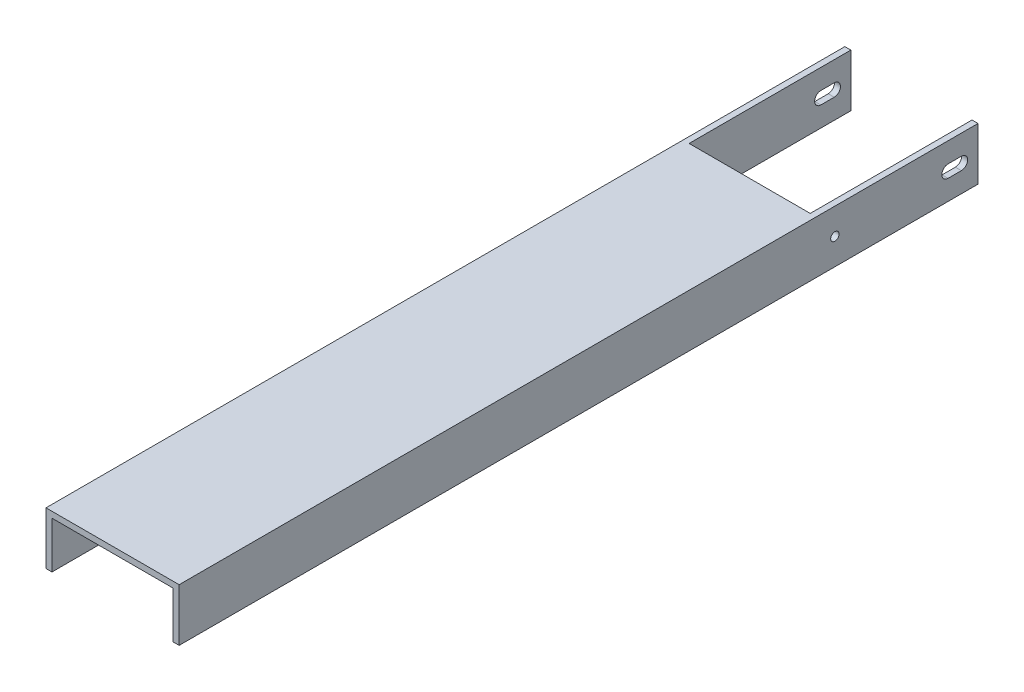
ISO-10303-21;
HEADER;
FILE_DESCRIPTION(('STEP AP214'),'2;1');
FILE_NAME('part.step','',(''),(''),'','','');
FILE_SCHEMA(('AUTOMOTIVE_DESIGN { 1 0 10303 214 1 1 1 1 }'));
ENDSEC;
DATA;
#1=APPLICATION_CONTEXT('core data for automotive mechanical design processes');
#2=APPLICATION_PROTOCOL_DEFINITION('international standard','automotive_design',2000,#1);
#3=PRODUCT_CONTEXT('',#1,'mechanical');
#4=PRODUCT('Part','Part','',(#3));
#5=PRODUCT_RELATED_PRODUCT_CATEGORY('part','',(#4));
#6=PRODUCT_DEFINITION_FORMATION('','',#4);
#7=PRODUCT_DEFINITION_CONTEXT('part definition',#1,'design');
#8=PRODUCT_DEFINITION('design','',#6,#7);
#9=PRODUCT_DEFINITION_SHAPE('','',#8);
#10=(LENGTH_UNIT() NAMED_UNIT(*) SI_UNIT(.MILLI.,.METRE.));
#11=(NAMED_UNIT(*) PLANE_ANGLE_UNIT() SI_UNIT($,.RADIAN.));
#12=(NAMED_UNIT(*) SI_UNIT($,.STERADIAN.) SOLID_ANGLE_UNIT());
#13=UNCERTAINTY_MEASURE_WITH_UNIT(LENGTH_MEASURE(1.E-05),#10,'distance_accuracy_value','');
#14=(GEOMETRIC_REPRESENTATION_CONTEXT(3) GLOBAL_UNCERTAINTY_ASSIGNED_CONTEXT((#13)) GLOBAL_UNIT_ASSIGNED_CONTEXT((#10,
#11,#12)) REPRESENTATION_CONTEXT('',''));
#15=CARTESIAN_POINT('',(0.,0.,0.));
#16=DIRECTION('',(0.,0.,1.));
#17=DIRECTION('',(1.,0.,0.));
#18=AXIS2_PLACEMENT_3D('',#15,#16,#17);
#19=CARTESIAN_POINT('',(-50.8,0.,0.));
#20=DIRECTION('',(0.,0.,-1.));
#21=DIRECTION('',(-1.,0.,0.));
#22=AXIS2_PLACEMENT_3D('',#19,#20,#21);
#23=PLANE('',#22);
#24=DIRECTION('',(0.,-1.,0.));
#25=VECTOR('',#24,1.);
#26=CARTESIAN_POINT('',(46.228,-40.132,0.));
#27=LINE('',#26,#25);
#28=CARTESIAN_POINT('',(46.228,0.,0.));
#29=VERTEX_POINT('',#28);
#30=CARTESIAN_POINT('',(46.228,-40.132,0.));
#31=VERTEX_POINT('',#30);
#32=EDGE_CURVE('E268',#29,#31,#27,.T.);
#33=ORIENTED_EDGE('',*,*,#32,.F.);
#34=DIRECTION('',(-1.,0.,0.));
#35=VECTOR('',#34,1.);
#36=CARTESIAN_POINT('',(-50.8,0.,0.));
#37=LINE('',#36,#35);
#38=CARTESIAN_POINT('',(50.8,0.,0.));
#39=VERTEX_POINT('',#38);
#40=EDGE_CURVE('E246',#39,#29,#37,.T.);
#41=ORIENTED_EDGE('',*,*,#40,.F.);
#42=DIRECTION('',(0.,1.,0.));
#43=VECTOR('',#42,1.);
#44=CARTESIAN_POINT('',(50.8,0.,0.));
#45=LINE('',#44,#43);
#46=CARTESIAN_POINT('',(50.8,-40.132,0.));
#47=VERTEX_POINT('',#46);
#48=EDGE_CURVE('E273',#47,#39,#45,.T.);
#49=ORIENTED_EDGE('',*,*,#48,.F.);
#50=DIRECTION('',(1.,0.,0.));
#51=VECTOR('',#50,1.);
#52=CARTESIAN_POINT('',(50.8,-40.132,0.));
#53=LINE('',#52,#51);
#54=EDGE_CURVE('E271',#31,#47,#53,.T.);
#55=ORIENTED_EDGE('',*,*,#54,.F.);
#56=EDGE_LOOP('',(#33,#41,#49,#55));
#57=FACE_BOUND('',#56,.T.);
#58=ADVANCED_FACE('F33',(#57),#23,.T.);
#59=CARTESIAN_POINT('',(-50.8,-40.132,609.6));
#60=DIRECTION('',(1.,0.,0.));
#61=DIRECTION('',(0.,0.,-1.));
#62=AXIS2_PLACEMENT_3D('',#59,#60,#61);
#63=PLANE('',#62);
#64=CARTESIAN_POINT('',(-50.8,-20.066,109.22));
#65=DIRECTION('',(1.,0.,0.));
#66=DIRECTION('',(0.,1.,0.));
#67=AXIS2_PLACEMENT_3D('',#64,#65,#66);
#68=CIRCLE('',#67,3.175);
#69=CARTESIAN_POINT('',(-50.8,-16.891,109.22));
#70=VERTEX_POINT('',#69);
#71=EDGE_CURVE('E397',#70,#70,#68,.T.);
#72=ORIENTED_EDGE('',*,*,#71,.T.);
#73=EDGE_LOOP('',(#72));
#74=FACE_BOUND('',#73,.T.);
#75=DIRECTION('',(0.,0.,-1.));
#76=VECTOR('',#75,1.);
#77=CARTESIAN_POINT('',(-50.8,-24.8285,12.7));
#78=LINE('',#77,#76);
#79=CARTESIAN_POINT('',(-50.8,-24.8285,22.86));
#80=VERTEX_POINT('',#79);
#81=CARTESIAN_POINT('',(-50.8,-24.8285,12.7));
#82=VERTEX_POINT('',#81);
#83=EDGE_CURVE('E177',#80,#82,#78,.T.);
#84=ORIENTED_EDGE('',*,*,#83,.T.);
#85=CARTESIAN_POINT('',(-50.8,-20.066,12.7));
#86=DIRECTION('',(1.,0.,0.));
#87=DIRECTION('',(0.,1.,0.));
#88=AXIS2_PLACEMENT_3D('',#85,#86,#87);
#89=CIRCLE('',#88,4.7625);
#90=CARTESIAN_POINT('',(-50.8,-15.3035,12.7));
#91=VERTEX_POINT('',#90);
#92=EDGE_CURVE('E161',#82,#91,#89,.T.);
#93=ORIENTED_EDGE('',*,*,#92,.T.);
#94=DIRECTION('',(0.,0.,1.));
#95=VECTOR('',#94,1.);
#96=CARTESIAN_POINT('',(-50.8,-15.3035,12.7));
#97=LINE('',#96,#95);
#98=CARTESIAN_POINT('',(-50.8,-15.3035,22.86));
#99=VERTEX_POINT('',#98);
#100=EDGE_CURVE('E170',#91,#99,#97,.T.);
#101=ORIENTED_EDGE('',*,*,#100,.T.);
#102=CARTESIAN_POINT('',(-50.8,-20.066,22.86));
#103=DIRECTION('',(1.,0.,0.));
#104=DIRECTION('',(0.,1.,0.));
#105=AXIS2_PLACEMENT_3D('',#102,#103,#104);
#106=CIRCLE('',#105,4.7625);
#107=EDGE_CURVE('E48',#99,#80,#106,.T.);
#108=ORIENTED_EDGE('',*,*,#107,.T.);
#109=EDGE_LOOP('',(#84,#93,#101,#108));
#110=FACE_BOUND('',#109,.T.);
#111=DIRECTION('',(0.,-1.,0.));
#112=VECTOR('',#111,1.);
#113=CARTESIAN_POINT('',(-50.8,-40.132,0.));
#114=LINE('',#113,#112);
#115=CARTESIAN_POINT('',(-50.8,0.,0.));
#116=VERTEX_POINT('',#115);
#117=CARTESIAN_POINT('',(-50.8,-40.132,0.));
#118=VERTEX_POINT('',#117);
#119=EDGE_CURVE('E241',#116,#118,#114,.T.);
#120=ORIENTED_EDGE('',*,*,#119,.T.);
#121=DIRECTION('',(0.,0.,-1.));
#122=VECTOR('',#121,1.);
#123=CARTESIAN_POINT('',(-50.8,-40.132,609.6));
#124=LINE('',#123,#122);
#125=CARTESIAN_POINT('',(-50.8,-40.132,609.6));
#126=VERTEX_POINT('',#125);
#127=EDGE_CURVE('E11',#126,#118,#124,.T.);
#128=ORIENTED_EDGE('',*,*,#127,.F.);
#129=DIRECTION('',(0.,-1.,0.));
#130=VECTOR('',#129,1.);
#131=CARTESIAN_POINT('',(-50.8,-40.132,609.6));
#132=LINE('',#131,#130);
#133=CARTESIAN_POINT('',(-50.8,0.,609.6));
#134=VERTEX_POINT('',#133);
#135=EDGE_CURVE('E242',#134,#126,#132,.T.);
#136=ORIENTED_EDGE('',*,*,#135,.F.);
#137=DIRECTION('',(0.,0.,-1.));
#138=VECTOR('',#137,1.);
#139=CARTESIAN_POINT('',(-50.8,0.,609.6));
#140=LINE('',#139,#138);
#141=EDGE_CURVE('E260',#134,#116,#140,.T.);
#142=ORIENTED_EDGE('',*,*,#141,.T.);
#143=EDGE_LOOP('',(#120,#128,#136,#142));
#144=FACE_BOUND('',#143,.T.);
#145=ADVANCED_FACE('F35',(#74,#110,#144),#63,.F.);
#146=CARTESIAN_POINT('',(-46.228,-40.132,609.6));
#147=DIRECTION('',(0.,1.,0.));
#148=DIRECTION('',(-1.,0.,0.));
#149=AXIS2_PLACEMENT_3D('',#146,#147,#148);
#150=PLANE('',#149);
#151=DIRECTION('',(1.,0.,0.));
#152=VECTOR('',#151,1.);
#153=CARTESIAN_POINT('',(-46.228,-40.132,0.));
#154=LINE('',#153,#152);
#155=CARTESIAN_POINT('',(-46.228,-40.132,0.));
#156=VERTEX_POINT('',#155);
#157=EDGE_CURVE('E263',#118,#156,#154,.T.);
#158=ORIENTED_EDGE('',*,*,#157,.T.);
#159=DIRECTION('',(0.,0.,-1.));
#160=VECTOR('',#159,1.);
#161=CARTESIAN_POINT('',(-46.228,-40.132,609.6));
#162=LINE('',#161,#160);
#163=CARTESIAN_POINT('',(-46.228,-40.132,609.6));
#164=VERTEX_POINT('',#163);
#165=EDGE_CURVE('E41',#164,#156,#162,.T.);
#166=ORIENTED_EDGE('',*,*,#165,.F.);
#167=DIRECTION('',(1.,0.,0.));
#168=VECTOR('',#167,1.);
#169=CARTESIAN_POINT('',(-46.228,-40.132,609.6));
#170=LINE('',#169,#168);
#171=EDGE_CURVE('E245',#126,#164,#170,.T.);
#172=ORIENTED_EDGE('',*,*,#171,.F.);
#173=ORIENTED_EDGE('',*,*,#127,.T.);
#174=EDGE_LOOP('',(#158,#166,#172,#173));
#175=FACE_BOUND('',#174,.T.);
#176=ADVANCED_FACE('F301',(#175),#150,.F.);
#177=CARTESIAN_POINT('',(-46.228,-4.57200000000001,609.6));
#178=DIRECTION('',(-1.,0.,0.));
#179=DIRECTION('',(0.,-1.,0.));
#180=AXIS2_PLACEMENT_3D('',#177,#178,#179);
#181=PLANE('',#180);
#182=CARTESIAN_POINT('',(-46.228,-20.066,109.22));
#183=DIRECTION('',(-1.,0.,0.));
#184=DIRECTION('',(0.,-1.,0.));
#185=AXIS2_PLACEMENT_3D('',#182,#183,#184);
#186=CIRCLE('',#185,3.175);
#187=CARTESIAN_POINT('',(-46.228,-23.241,109.22));
#188=VERTEX_POINT('',#187);
#189=EDGE_CURVE('E184',#188,#188,#186,.T.);
#190=ORIENTED_EDGE('',*,*,#189,.T.);
#191=EDGE_LOOP('',(#190));
#192=FACE_BOUND('',#191,.T.);
#193=DIRECTION('',(0.,0.,-1.));
#194=VECTOR('',#193,1.);
#195=CARTESIAN_POINT('',(-46.228,-15.3035000000001,609.6));
#196=LINE('',#195,#194);
#197=CARTESIAN_POINT('',(-46.228,-15.3035,22.86));
#198=VERTEX_POINT('',#197);
#199=CARTESIAN_POINT('',(-46.228,-15.3035,12.7));
#200=VERTEX_POINT('',#199);
#201=EDGE_CURVE('E207',#198,#200,#196,.T.);
#202=ORIENTED_EDGE('',*,*,#201,.T.);
#203=CARTESIAN_POINT('',(-46.228,-20.066,12.7));
#204=DIRECTION('',(-1.,0.,0.));
#205=DIRECTION('',(0.,-1.,0.));
#206=AXIS2_PLACEMENT_3D('',#203,#204,#205);
#207=CIRCLE('',#206,4.7625);
#208=CARTESIAN_POINT('',(-46.228,-24.8285,12.7));
#209=VERTEX_POINT('',#208);
#210=EDGE_CURVE('E164',#200,#209,#207,.T.);
#211=ORIENTED_EDGE('',*,*,#210,.T.);
#212=DIRECTION('',(0.,0.,1.));
#213=VECTOR('',#212,1.);
#214=CARTESIAN_POINT('',(-46.228,-24.8285,609.6));
#215=LINE('',#214,#213);
#216=CARTESIAN_POINT('',(-46.228,-24.8285,22.86));
#217=VERTEX_POINT('',#216);
#218=EDGE_CURVE('E218',#209,#217,#215,.T.);
#219=ORIENTED_EDGE('',*,*,#218,.T.);
#220=CARTESIAN_POINT('',(-46.228,-20.066,22.86));
#221=DIRECTION('',(-1.,0.,0.));
#222=DIRECTION('',(0.,-1.,0.));
#223=AXIS2_PLACEMENT_3D('',#220,#221,#222);
#224=CIRCLE('',#223,4.7625);
#225=EDGE_CURVE('E212',#217,#198,#224,.T.);
#226=ORIENTED_EDGE('',*,*,#225,.T.);
#227=EDGE_LOOP('',(#202,#211,#219,#226));
#228=FACE_BOUND('',#227,.T.);
#229=ORIENTED_EDGE('',*,*,#165,.T.);
#230=DIRECTION('',(0.,1.,0.));
#231=VECTOR('',#230,1.);
#232=CARTESIAN_POINT('',(-46.228,-4.57200000000001,0.));
#233=LINE('',#232,#231);
#234=CARTESIAN_POINT('',(-46.228,0.,0.));
#235=VERTEX_POINT('',#234);
#236=EDGE_CURVE('E266',#156,#235,#233,.T.);
#237=ORIENTED_EDGE('',*,*,#236,.T.);
#238=DIRECTION('',(0.,0.,1.));
#239=VECTOR('',#238,1.);
#240=CARTESIAN_POINT('',(-46.228,0.,123.444));
#241=LINE('',#240,#239);
#242=CARTESIAN_POINT('',(-46.228,0.,123.444));
#243=VERTEX_POINT('',#242);
#244=EDGE_CURVE('E228',#235,#243,#241,.T.);
#245=ORIENTED_EDGE('',*,*,#244,.T.);
#246=DIRECTION('',(0.,1.,0.));
#247=VECTOR('',#246,1.);
#248=CARTESIAN_POINT('',(-46.228,-40.132,123.444));
#249=LINE('',#248,#247);
#250=CARTESIAN_POINT('',(-46.228,-4.57200000000001,123.444));
#251=VERTEX_POINT('',#250);
#252=EDGE_CURVE('E234',#251,#243,#249,.T.);
#253=ORIENTED_EDGE('',*,*,#252,.F.);
#254=DIRECTION('',(0.,0.,-1.));
#255=VECTOR('',#254,1.);
#256=CARTESIAN_POINT('',(-46.228,-4.57200000000001,609.6));
#257=LINE('',#256,#255);
#258=CARTESIAN_POINT('',(-46.228,-4.57200000000001,609.6));
#259=VERTEX_POINT('',#258);
#260=EDGE_CURVE('E291',#259,#251,#257,.T.);
#261=ORIENTED_EDGE('',*,*,#260,.F.);
#262=DIRECTION('',(0.,1.,0.));
#263=VECTOR('',#262,1.);
#264=CARTESIAN_POINT('',(-46.228,-4.57200000000001,609.6));
#265=LINE('',#264,#263);
#266=EDGE_CURVE('E248',#164,#259,#265,.T.);
#267=ORIENTED_EDGE('',*,*,#266,.F.);
#268=EDGE_LOOP('',(#229,#237,#245,#253,#261,#267));
#269=FACE_BOUND('',#268,.T.);
#270=ADVANCED_FACE('F296',(#192,#228,#269),#181,.F.);
#271=CARTESIAN_POINT('',(46.228,-4.57199999999999,609.6));
#272=DIRECTION('',(0.,1.,0.));
#273=DIRECTION('',(-1.,0.,0.));
#274=AXIS2_PLACEMENT_3D('',#271,#272,#273);
#275=PLANE('',#274);
#276=ORIENTED_EDGE('',*,*,#260,.T.);
#277=DIRECTION('',(1.,0.,0.));
#278=VECTOR('',#277,1.);
#279=CARTESIAN_POINT('',(46.228,-4.57199999999999,123.444));
#280=LINE('',#279,#278);
#281=CARTESIAN_POINT('',(46.228,-4.57199999999999,123.444));
#282=VERTEX_POINT('',#281);
#283=EDGE_CURVE('E237',#251,#282,#280,.T.);
#284=ORIENTED_EDGE('',*,*,#283,.T.);
#285=DIRECTION('',(0.,0.,-1.));
#286=VECTOR('',#285,1.);
#287=CARTESIAN_POINT('',(46.228,-4.57199999999999,609.6));
#288=LINE('',#287,#286);
#289=CARTESIAN_POINT('',(46.228,-4.57199999999999,609.6));
#290=VERTEX_POINT('',#289);
#291=EDGE_CURVE('E288',#290,#282,#288,.T.);
#292=ORIENTED_EDGE('',*,*,#291,.F.);
#293=DIRECTION('',(1.,0.,0.));
#294=VECTOR('',#293,1.);
#295=CARTESIAN_POINT('',(46.228,-4.57199999999999,609.6));
#296=LINE('',#295,#294);
#297=EDGE_CURVE('E250',#259,#290,#296,.T.);
#298=ORIENTED_EDGE('',*,*,#297,.F.);
#299=EDGE_LOOP('',(#276,#284,#292,#298));
#300=FACE_BOUND('',#299,.T.);
#301=ADVANCED_FACE('F331',(#300),#275,.F.);
#302=CARTESIAN_POINT('',(46.228,-40.132,609.6));
#303=DIRECTION('',(1.,0.,0.));
#304=DIRECTION('',(0.,1.,0.));
#305=AXIS2_PLACEMENT_3D('',#302,#303,#304);
#306=PLANE('',#305);
#307=CARTESIAN_POINT('',(46.228,-20.066,109.22));
#308=DIRECTION('',(1.,0.,0.));
#309=DIRECTION('',(0.,1.,0.));
#310=AXIS2_PLACEMENT_3D('',#307,#308,#309);
#311=CIRCLE('',#310,3.175);
#312=CARTESIAN_POINT('',(46.228,-16.891,109.22));
#313=VERTEX_POINT('',#312);
#314=EDGE_CURVE('E401',#313,#313,#311,.T.);
#315=ORIENTED_EDGE('',*,*,#314,.T.);
#316=EDGE_LOOP('',(#315));
#317=FACE_BOUND('',#316,.T.);
#318=DIRECTION('',(0.,0.,-1.));
#319=VECTOR('',#318,1.);
#320=CARTESIAN_POINT('',(46.228,-24.8285,609.6));
#321=LINE('',#320,#319);
#322=CARTESIAN_POINT('',(46.228,-24.8285,22.86));
#323=VERTEX_POINT('',#322);
#324=CARTESIAN_POINT('',(46.228,-24.8285,12.7));
#325=VERTEX_POINT('',#324);
#326=EDGE_CURVE('E215',#323,#325,#321,.T.);
#327=ORIENTED_EDGE('',*,*,#326,.T.);
#328=CARTESIAN_POINT('',(46.228,-20.066,12.7));
#329=DIRECTION('',(1.,0.,0.));
#330=DIRECTION('',(0.,1.,0.));
#331=AXIS2_PLACEMENT_3D('',#328,#329,#330);
#332=CIRCLE('',#331,4.7625);
#333=CARTESIAN_POINT('',(46.228,-15.3035,12.7));
#334=VERTEX_POINT('',#333);
#335=EDGE_CURVE('E221',#325,#334,#332,.T.);
#336=ORIENTED_EDGE('',*,*,#335,.T.);
#337=DIRECTION('',(0.,0.,1.));
#338=VECTOR('',#337,1.);
#339=CARTESIAN_POINT('',(46.228,-15.3035000000001,609.6));
#340=LINE('',#339,#338);
#341=CARTESIAN_POINT('',(46.228,-15.3035,22.86));
#342=VERTEX_POINT('',#341);
#343=EDGE_CURVE('E198',#334,#342,#340,.T.);
#344=ORIENTED_EDGE('',*,*,#343,.T.);
#345=CARTESIAN_POINT('',(46.228,-20.066,22.86));
#346=DIRECTION('',(1.,0.,0.));
#347=DIRECTION('',(0.,1.,0.));
#348=AXIS2_PLACEMENT_3D('',#345,#346,#347);
#349=CIRCLE('',#348,4.7625);
#350=EDGE_CURVE('E209',#342,#323,#349,.T.);
#351=ORIENTED_EDGE('',*,*,#350,.T.);
#352=EDGE_LOOP('',(#327,#336,#344,#351));
#353=FACE_BOUND('',#352,.T.);
#354=ORIENTED_EDGE('',*,*,#291,.T.);
#355=DIRECTION('',(0.,1.,0.));
#356=VECTOR('',#355,1.);
#357=CARTESIAN_POINT('',(46.228,-40.132,123.444));
#358=LINE('',#357,#356);
#359=CARTESIAN_POINT('',(46.228,0.,123.444));
#360=VERTEX_POINT('',#359);
#361=EDGE_CURVE('E235',#282,#360,#358,.T.);
#362=ORIENTED_EDGE('',*,*,#361,.T.);
#363=DIRECTION('',(0.,0.,-1.));
#364=VECTOR('',#363,1.);
#365=CARTESIAN_POINT('',(46.228,0.,123.444));
#366=LINE('',#365,#364);
#367=EDGE_CURVE('E225',#360,#29,#366,.T.);
#368=ORIENTED_EDGE('',*,*,#367,.T.);
#369=ORIENTED_EDGE('',*,*,#32,.T.);
#370=DIRECTION('',(0.,0.,-1.));
#371=VECTOR('',#370,1.);
#372=CARTESIAN_POINT('',(46.228,-40.132,609.6));
#373=LINE('',#372,#371);
#374=CARTESIAN_POINT('',(46.228,-40.132,609.6));
#375=VERTEX_POINT('',#374);
#376=EDGE_CURVE('E286',#375,#31,#373,.T.);
#377=ORIENTED_EDGE('',*,*,#376,.F.);
#378=DIRECTION('',(0.,-1.,0.));
#379=VECTOR('',#378,1.);
#380=CARTESIAN_POINT('',(46.228,-40.132,609.6));
#381=LINE('',#380,#379);
#382=EDGE_CURVE('E252',#290,#375,#381,.T.);
#383=ORIENTED_EDGE('',*,*,#382,.F.);
#384=EDGE_LOOP('',(#354,#362,#368,#369,#377,#383));
#385=FACE_BOUND('',#384,.T.);
#386=ADVANCED_FACE('F325',(#317,#353,#385),#306,.F.);
#387=CARTESIAN_POINT('',(50.8,-40.132,609.6));
#388=DIRECTION('',(0.,1.,0.));
#389=DIRECTION('',(0.,0.,1.));
#390=AXIS2_PLACEMENT_3D('',#387,#388,#389);
#391=PLANE('',#390);
#392=ORIENTED_EDGE('',*,*,#54,.T.);
#393=DIRECTION('',(0.,0.,-1.));
#394=VECTOR('',#393,1.);
#395=CARTESIAN_POINT('',(50.8,-40.132,609.6));
#396=LINE('',#395,#394);
#397=CARTESIAN_POINT('',(50.8,-40.132,609.6));
#398=VERTEX_POINT('',#397);
#399=EDGE_CURVE('E283',#398,#47,#396,.T.);
#400=ORIENTED_EDGE('',*,*,#399,.F.);
#401=DIRECTION('',(1.,0.,0.));
#402=VECTOR('',#401,1.);
#403=CARTESIAN_POINT('',(50.8,-40.132,609.6));
#404=LINE('',#403,#402);
#405=EDGE_CURVE('E254',#375,#398,#404,.T.);
#406=ORIENTED_EDGE('',*,*,#405,.F.);
#407=ORIENTED_EDGE('',*,*,#376,.T.);
#408=EDGE_LOOP('',(#392,#400,#406,#407));
#409=FACE_BOUND('',#408,.T.);
#410=ADVANCED_FACE('F337',(#409),#391,.F.);
#411=CARTESIAN_POINT('',(50.8,0.,609.6));
#412=DIRECTION('',(-1.,0.,0.));
#413=DIRECTION('',(0.,-1.,0.));
#414=AXIS2_PLACEMENT_3D('',#411,#412,#413);
#415=PLANE('',#414);
#416=CARTESIAN_POINT('',(50.8,-20.066,109.22));
#417=DIRECTION('',(1.,0.,0.));
#418=DIRECTION('',(0.,1.,0.));
#419=AXIS2_PLACEMENT_3D('',#416,#417,#418);
#420=CIRCLE('',#419,3.175);
#421=CARTESIAN_POINT('',(50.8,-16.891,109.22));
#422=VERTEX_POINT('',#421);
#423=EDGE_CURVE('E405',#422,#422,#420,.T.);
#424=ORIENTED_EDGE('',*,*,#423,.F.);
#425=EDGE_LOOP('',(#424));
#426=FACE_BOUND('',#425,.T.);
#427=DIRECTION('',(0.,0.,1.));
#428=VECTOR('',#427,1.);
#429=CARTESIAN_POINT('',(50.8,-15.3035,12.7));
#430=LINE('',#429,#428);
#431=CARTESIAN_POINT('',(50.8,-15.3035,12.7));
#432=VERTEX_POINT('',#431);
#433=CARTESIAN_POINT('',(50.8,-15.3035,22.86));
#434=VERTEX_POINT('',#433);
#435=EDGE_CURVE('E191',#432,#434,#430,.T.);
#436=ORIENTED_EDGE('',*,*,#435,.F.);
#437=CARTESIAN_POINT('',(50.8,-20.066,12.7));
#438=DIRECTION('',(1.,0.,0.));
#439=DIRECTION('',(0.,1.,0.));
#440=AXIS2_PLACEMENT_3D('',#437,#438,#439);
#441=CIRCLE('',#440,4.7625);
#442=CARTESIAN_POINT('',(50.8,-24.8285,12.7));
#443=VERTEX_POINT('',#442);
#444=EDGE_CURVE('E189',#443,#432,#441,.T.);
#445=ORIENTED_EDGE('',*,*,#444,.F.);
#446=DIRECTION('',(0.,0.,-1.));
#447=VECTOR('',#446,1.);
#448=CARTESIAN_POINT('',(50.8,-24.8285,12.7));
#449=LINE('',#448,#447);
#450=CARTESIAN_POINT('',(50.8,-24.8285,22.86));
#451=VERTEX_POINT('',#450);
#452=EDGE_CURVE('E178',#451,#443,#449,.T.);
#453=ORIENTED_EDGE('',*,*,#452,.F.);
#454=CARTESIAN_POINT('',(50.8,-20.066,22.86));
#455=DIRECTION('',(1.,0.,0.));
#456=DIRECTION('',(0.,1.,0.));
#457=AXIS2_PLACEMENT_3D('',#454,#455,#456);
#458=CIRCLE('',#457,4.7625);
#459=EDGE_CURVE('E181',#434,#451,#458,.T.);
#460=ORIENTED_EDGE('',*,*,#459,.F.);
#461=EDGE_LOOP('',(#436,#445,#453,#460));
#462=FACE_BOUND('',#461,.T.);
#463=ORIENTED_EDGE('',*,*,#48,.T.);
#464=DIRECTION('',(0.,0.,-1.));
#465=VECTOR('',#464,1.);
#466=CARTESIAN_POINT('',(50.8,0.,609.6));
#467=LINE('',#466,#465);
#468=CARTESIAN_POINT('',(50.8,0.,609.6));
#469=VERTEX_POINT('',#468);
#470=EDGE_CURVE('E280',#469,#39,#467,.T.);
#471=ORIENTED_EDGE('',*,*,#470,.F.);
#472=DIRECTION('',(0.,1.,0.));
#473=VECTOR('',#472,1.);
#474=CARTESIAN_POINT('',(50.8,0.,609.6));
#475=LINE('',#474,#473);
#476=EDGE_CURVE('E256',#398,#469,#475,.T.);
#477=ORIENTED_EDGE('',*,*,#476,.F.);
#478=ORIENTED_EDGE('',*,*,#399,.T.);
#479=EDGE_LOOP('',(#463,#471,#477,#478));
#480=FACE_BOUND('',#479,.T.);
#481=ADVANCED_FACE('F338',(#426,#462,#480),#415,.F.);
#482=CARTESIAN_POINT('',(-50.8,0.,609.6));
#483=DIRECTION('',(0.,-1.,0.));
#484=DIRECTION('',(1.,0.,0.));
#485=AXIS2_PLACEMENT_3D('',#482,#483,#484);
#486=PLANE('',#485);
#487=ORIENTED_EDGE('',*,*,#40,.T.);
#488=ORIENTED_EDGE('',*,*,#367,.F.);
#489=DIRECTION('',(1.,0.,0.));
#490=VECTOR('',#489,1.);
#491=CARTESIAN_POINT('',(-46.228,0.,123.444));
#492=LINE('',#491,#490);
#493=EDGE_CURVE('E231',#243,#360,#492,.T.);
#494=ORIENTED_EDGE('',*,*,#493,.F.);
#495=ORIENTED_EDGE('',*,*,#244,.F.);
#496=EDGE_CURVE('E275',#235,#116,#37,.T.);
#497=ORIENTED_EDGE('',*,*,#496,.T.);
#498=ORIENTED_EDGE('',*,*,#141,.F.);
#499=DIRECTION('',(-1.,0.,0.));
#500=VECTOR('',#499,1.);
#501=CARTESIAN_POINT('',(-50.8,0.,609.6));
#502=LINE('',#501,#500);
#503=EDGE_CURVE('E258',#469,#134,#502,.T.);
#504=ORIENTED_EDGE('',*,*,#503,.F.);
#505=ORIENTED_EDGE('',*,*,#470,.T.);
#506=EDGE_LOOP('',(#487,#488,#494,#495,#497,#498,#504,#505));
#507=FACE_BOUND('',#506,.T.);
#508=ADVANCED_FACE('F309',(#507),#486,.F.);
#509=CARTESIAN_POINT('',(-50.8,0.,609.6));
#510=DIRECTION('',(0.,0.,-1.));
#511=DIRECTION('',(-1.,0.,0.));
#512=AXIS2_PLACEMENT_3D('',#509,#510,#511);
#513=PLANE('',#512);
#514=ORIENTED_EDGE('',*,*,#135,.T.);
#515=ORIENTED_EDGE('',*,*,#171,.T.);
#516=ORIENTED_EDGE('',*,*,#266,.T.);
#517=ORIENTED_EDGE('',*,*,#297,.T.);
#518=ORIENTED_EDGE('',*,*,#382,.T.);
#519=ORIENTED_EDGE('',*,*,#405,.T.);
#520=ORIENTED_EDGE('',*,*,#476,.T.);
#521=ORIENTED_EDGE('',*,*,#503,.T.);
#522=EDGE_LOOP('',(#514,#515,#516,#517,#518,#519,#520,#521));
#523=FACE_BOUND('',#522,.T.);
#524=ADVANCED_FACE('F314',(#523),#513,.F.);
#525=ORIENTED_EDGE('',*,*,#496,.F.);
#526=ORIENTED_EDGE('',*,*,#236,.F.);
#527=ORIENTED_EDGE('',*,*,#157,.F.);
#528=ORIENTED_EDGE('',*,*,#119,.F.);
#529=EDGE_LOOP('',(#525,#526,#527,#528));
#530=FACE_BOUND('',#529,.T.);
#531=ADVANCED_FACE('F306',(#530),#23,.T.);
#532=CARTESIAN_POINT('',(-46.228,-40.132,123.444));
#533=DIRECTION('',(0.,0.,1.));
#534=DIRECTION('',(1.,0.,0.));
#535=AXIS2_PLACEMENT_3D('',#532,#533,#534);
#536=PLANE('',#535);
#537=ORIENTED_EDGE('',*,*,#252,.T.);
#538=ORIENTED_EDGE('',*,*,#493,.T.);
#539=ORIENTED_EDGE('',*,*,#361,.F.);
#540=ORIENTED_EDGE('',*,*,#283,.F.);
#541=EDGE_LOOP('',(#537,#538,#539,#540));
#542=FACE_BOUND('',#541,.T.);
#543=ADVANCED_FACE('F327',(#542),#536,.F.);
#544=CARTESIAN_POINT('',(-50.8,-15.3035,12.7));
#545=DIRECTION('',(0.,1.,0.));
#546=DIRECTION('',(-1.,0.,0.));
#547=AXIS2_PLACEMENT_3D('',#544,#545,#546);
#548=PLANE('',#547);
#549=DIRECTION('',(1.,0.,0.));
#550=VECTOR('',#549,1.);
#551=CARTESIAN_POINT('',(-50.8,-15.3035,12.7));
#552=LINE('',#551,#550);
#553=EDGE_CURVE('E167',#334,#432,#552,.T.);
#554=ORIENTED_EDGE('',*,*,#553,.T.);
#555=ORIENTED_EDGE('',*,*,#435,.T.);
#556=DIRECTION('',(1.,0.,0.));
#557=VECTOR('',#556,1.);
#558=CARTESIAN_POINT('',(-50.8,-15.3035,22.86));
#559=LINE('',#558,#557);
#560=EDGE_CURVE('E166',#342,#434,#559,.T.);
#561=ORIENTED_EDGE('',*,*,#560,.F.);
#562=ORIENTED_EDGE('',*,*,#343,.F.);
#563=EDGE_LOOP('',(#554,#555,#561,#562));
#564=FACE_BOUND('',#563,.T.);
#565=ADVANCED_FACE('F366',(#564),#548,.F.);
#566=CARTESIAN_POINT('',(-50.8,-20.066,22.86));
#567=DIRECTION('',(1.,0.,0.));
#568=DIRECTION('',(0.,1.,0.));
#569=AXIS2_PLACEMENT_3D('',#566,#567,#568);
#570=CYLINDRICAL_SURFACE('',#569,4.7625);
#571=ORIENTED_EDGE('',*,*,#560,.T.);
#572=ORIENTED_EDGE('',*,*,#459,.T.);
#573=DIRECTION('',(1.,0.,0.));
#574=VECTOR('',#573,1.);
#575=CARTESIAN_POINT('',(-50.8,-24.8285,22.86));
#576=LINE('',#575,#574);
#577=EDGE_CURVE('E203',#323,#451,#576,.T.);
#578=ORIENTED_EDGE('',*,*,#577,.F.);
#579=ORIENTED_EDGE('',*,*,#350,.F.);
#580=EDGE_LOOP('',(#571,#572,#578,#579));
#581=FACE_BOUND('',#580,.T.);
#582=ADVANCED_FACE('F382',(#581),#570,.F.);
#583=CARTESIAN_POINT('',(-50.8,-24.8285,12.7));
#584=DIRECTION('',(0.,-1.,0.));
#585=DIRECTION('',(1.,0.,0.));
#586=AXIS2_PLACEMENT_3D('',#583,#584,#585);
#587=PLANE('',#586);
#588=ORIENTED_EDGE('',*,*,#577,.T.);
#589=ORIENTED_EDGE('',*,*,#452,.T.);
#590=DIRECTION('',(1.,0.,0.));
#591=VECTOR('',#590,1.);
#592=CARTESIAN_POINT('',(-50.8,-24.8285,12.7));
#593=LINE('',#592,#591);
#594=EDGE_CURVE('E199',#325,#443,#593,.T.);
#595=ORIENTED_EDGE('',*,*,#594,.F.);
#596=ORIENTED_EDGE('',*,*,#326,.F.);
#597=EDGE_LOOP('',(#588,#589,#595,#596));
#598=FACE_BOUND('',#597,.T.);
#599=ADVANCED_FACE('F386',(#598),#587,.F.);
#600=CARTESIAN_POINT('',(-50.8,-20.066,12.7));
#601=DIRECTION('',(1.,0.,0.));
#602=DIRECTION('',(0.,1.,0.));
#603=AXIS2_PLACEMENT_3D('',#600,#601,#602);
#604=CYLINDRICAL_SURFACE('',#603,4.7625);
#605=ORIENTED_EDGE('',*,*,#594,.T.);
#606=ORIENTED_EDGE('',*,*,#444,.T.);
#607=ORIENTED_EDGE('',*,*,#553,.F.);
#608=ORIENTED_EDGE('',*,*,#335,.F.);
#609=EDGE_LOOP('',(#605,#606,#607,#608));
#610=FACE_BOUND('',#609,.T.);
#611=ADVANCED_FACE('F375',(#610),#604,.F.);
#612=EDGE_CURVE('E56',#91,#200,#552,.T.);
#613=ORIENTED_EDGE('',*,*,#612,.F.);
#614=ORIENTED_EDGE('',*,*,#92,.F.);
#615=EDGE_CURVE('E196',#82,#209,#593,.T.);
#616=ORIENTED_EDGE('',*,*,#615,.T.);
#617=ORIENTED_EDGE('',*,*,#210,.F.);
#618=EDGE_LOOP('',(#613,#614,#616,#617));
#619=FACE_BOUND('',#618,.T.);
#620=ADVANCED_FACE('F158',(#619),#604,.F.);
#621=ORIENTED_EDGE('',*,*,#615,.F.);
#622=ORIENTED_EDGE('',*,*,#83,.F.);
#623=EDGE_CURVE('E200',#80,#217,#576,.T.);
#624=ORIENTED_EDGE('',*,*,#623,.T.);
#625=ORIENTED_EDGE('',*,*,#218,.F.);
#626=EDGE_LOOP('',(#621,#622,#624,#625));
#627=FACE_BOUND('',#626,.T.);
#628=ADVANCED_FACE('F374',(#627),#587,.F.);
#629=ORIENTED_EDGE('',*,*,#623,.F.);
#630=ORIENTED_EDGE('',*,*,#107,.F.);
#631=EDGE_CURVE('E172',#99,#198,#559,.T.);
#632=ORIENTED_EDGE('',*,*,#631,.T.);
#633=ORIENTED_EDGE('',*,*,#225,.F.);
#634=EDGE_LOOP('',(#629,#630,#632,#633));
#635=FACE_BOUND('',#634,.T.);
#636=ADVANCED_FACE('F379',(#635),#570,.F.);
#637=ORIENTED_EDGE('',*,*,#631,.F.);
#638=ORIENTED_EDGE('',*,*,#100,.F.);
#639=ORIENTED_EDGE('',*,*,#612,.T.);
#640=ORIENTED_EDGE('',*,*,#201,.F.);
#641=EDGE_LOOP('',(#637,#638,#639,#640));
#642=FACE_BOUND('',#641,.T.);
#643=ADVANCED_FACE('F171',(#642),#548,.F.);
#644=CARTESIAN_POINT('',(-50.8,-20.066,109.22));
#645=DIRECTION('',(1.,0.,0.));
#646=DIRECTION('',(0.,1.,0.));
#647=AXIS2_PLACEMENT_3D('',#644,#645,#646);
#648=CYLINDRICAL_SURFACE('',#647,3.175);
#649=ORIENTED_EDGE('',*,*,#423,.T.);
#650=EDGE_LOOP('',(#649));
#651=FACE_BOUND('',#650,.T.);
#652=ORIENTED_EDGE('',*,*,#314,.F.);
#653=EDGE_LOOP('',(#652));
#654=FACE_BOUND('',#653,.T.);
#655=ADVANCED_FACE('F378',(#651,#654),#648,.F.);
#656=ORIENTED_EDGE('',*,*,#71,.F.);
#657=EDGE_LOOP('',(#656));
#658=FACE_BOUND('',#657,.T.);
#659=ORIENTED_EDGE('',*,*,#189,.F.);
#660=EDGE_LOOP('',(#659));
#661=FACE_BOUND('',#660,.T.);
#662=ADVANCED_FACE('F387',(#658,#661),#648,.F.);
#663=CLOSED_SHELL('',(#58,#145,#176,#270,#301,#386,#410,#481,#508,#524,#531,#543,#565,#582,#599,
#611,#620,#628,#636,#643,#655,#662));
#664=MANIFOLD_SOLID_BREP('B2',#663);
#665=ADVANCED_BREP_SHAPE_REPRESENTATION('',(#18,#664),#14);
#666=SHAPE_DEFINITION_REPRESENTATION(#9,#665);
ENDSEC;
END-ISO-10303-21;
